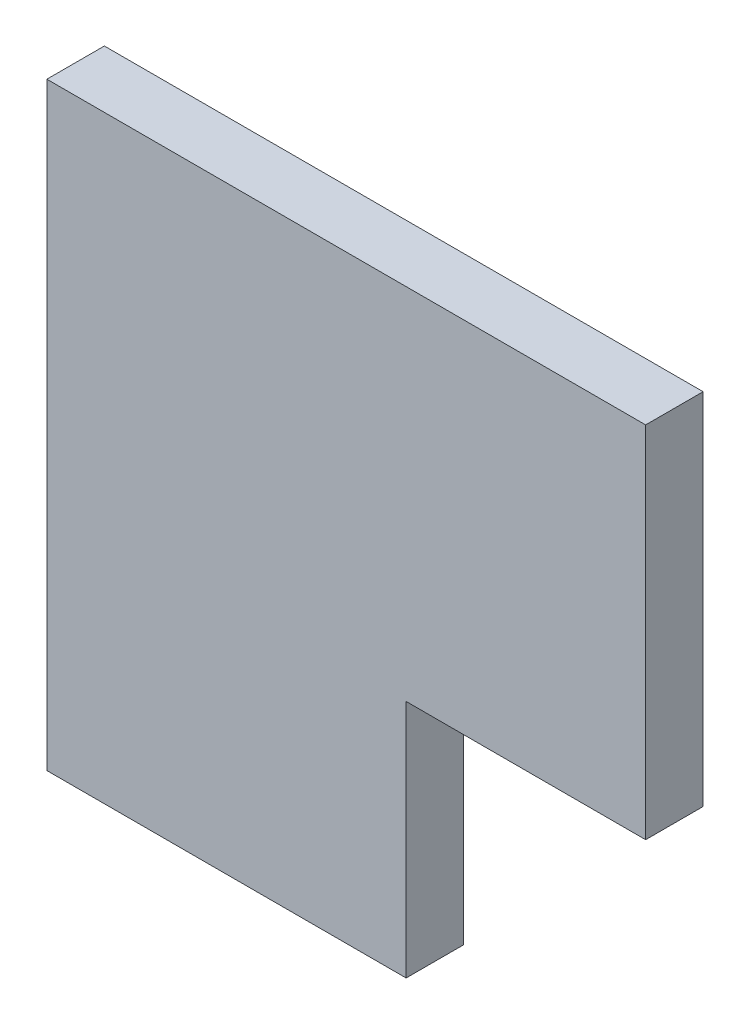
ISO-10303-21;
HEADER;
FILE_DESCRIPTION(('STEP AP214'),'2;1');
FILE_NAME('part.step','',(''),(''),'','','');
FILE_SCHEMA(('AUTOMOTIVE_DESIGN { 1 0 10303 214 1 1 1 1 }'));
ENDSEC;
DATA;
#1=APPLICATION_CONTEXT('core data for automotive mechanical design processes');
#2=APPLICATION_PROTOCOL_DEFINITION('international standard','automotive_design',2000,#1);
#3=PRODUCT_CONTEXT('',#1,'mechanical');
#4=PRODUCT('Part','Part','',(#3));
#5=PRODUCT_RELATED_PRODUCT_CATEGORY('part','',(#4));
#6=PRODUCT_DEFINITION_FORMATION('','',#4);
#7=PRODUCT_DEFINITION_CONTEXT('part definition',#1,'design');
#8=PRODUCT_DEFINITION('design','',#6,#7);
#9=PRODUCT_DEFINITION_SHAPE('','',#8);
#10=(LENGTH_UNIT() NAMED_UNIT(*) SI_UNIT(.MILLI.,.METRE.));
#11=(NAMED_UNIT(*) PLANE_ANGLE_UNIT() SI_UNIT($,.RADIAN.));
#12=(NAMED_UNIT(*) SI_UNIT($,.STERADIAN.) SOLID_ANGLE_UNIT());
#13=UNCERTAINTY_MEASURE_WITH_UNIT(LENGTH_MEASURE(1.E-05),#10,'distance_accuracy_value','');
#14=(GEOMETRIC_REPRESENTATION_CONTEXT(3) GLOBAL_UNCERTAINTY_ASSIGNED_CONTEXT((#13)) GLOBAL_UNIT_ASSIGNED_CONTEXT((#10,
#11,#12)) REPRESENTATION_CONTEXT('',''));
#15=CARTESIAN_POINT('',(0.,0.,0.));
#16=DIRECTION('',(0.,0.,1.));
#17=DIRECTION('',(1.,0.,0.));
#18=AXIS2_PLACEMENT_3D('',#15,#16,#17);
#19=CARTESIAN_POINT('',(-1.,0.,0.12));
#20=DIRECTION('',(0.,1.,0.));
#21=DIRECTION('',(0.,0.,1.));
#22=AXIS2_PLACEMENT_3D('',#19,#20,#21);
#23=PLANE('',#22);
#24=DIRECTION('',(1.,0.,0.));
#25=VECTOR('',#24,1.);
#26=CARTESIAN_POINT('',(-1.,0.,-0.12));
#27=LINE('',#26,#25);
#28=CARTESIAN_POINT('',(-1.,0.,-0.12));
#29=VERTEX_POINT('',#28);
#30=CARTESIAN_POINT('',(0.,0.,-0.12));
#31=VERTEX_POINT('',#30);
#32=EDGE_CURVE('E127',#29,#31,#27,.T.);
#33=ORIENTED_EDGE('',*,*,#32,.T.);
#34=DIRECTION('',(0.,0.,-1.));
#35=VECTOR('',#34,1.);
#36=CARTESIAN_POINT('',(0.,0.,0.12));
#37=LINE('',#36,#35);
#38=CARTESIAN_POINT('',(0.,0.,0.12));
#39=VERTEX_POINT('',#38);
#40=EDGE_CURVE('E11',#39,#31,#37,.T.);
#41=ORIENTED_EDGE('',*,*,#40,.F.);
#42=DIRECTION('',(1.,0.,0.));
#43=VECTOR('',#42,1.);
#44=CARTESIAN_POINT('',(-1.,0.,0.12));
#45=LINE('',#44,#43);
#46=CARTESIAN_POINT('',(-1.,0.,0.12));
#47=VERTEX_POINT('',#46);
#48=EDGE_CURVE('E143',#47,#39,#45,.T.);
#49=ORIENTED_EDGE('',*,*,#48,.F.);
#50=DIRECTION('',(0.,0.,-1.));
#51=VECTOR('',#50,1.);
#52=CARTESIAN_POINT('',(-1.,0.,0.12));
#53=LINE('',#52,#51);
#54=EDGE_CURVE('E123',#47,#29,#53,.T.);
#55=ORIENTED_EDGE('',*,*,#54,.T.);
#56=EDGE_LOOP('',(#33,#41,#49,#55));
#57=FACE_BOUND('',#56,.T.);
#58=ADVANCED_FACE('F38',(#57),#23,.F.);
#59=CARTESIAN_POINT('',(0.,0.,0.12));
#60=DIRECTION('',(-1.,0.,0.));
#61=DIRECTION('',(0.,0.,1.));
#62=AXIS2_PLACEMENT_3D('',#59,#60,#61);
#63=PLANE('',#62);
#64=DIRECTION('',(0.,1.,0.));
#65=VECTOR('',#64,1.);
#66=CARTESIAN_POINT('',(0.,0.,-0.12));
#67=LINE('',#66,#65);
#68=CARTESIAN_POINT('',(0.,1.5,-0.12));
#69=VERTEX_POINT('',#68);
#70=EDGE_CURVE('E131',#31,#69,#67,.T.);
#71=ORIENTED_EDGE('',*,*,#70,.T.);
#72=DIRECTION('',(0.,0.,-1.));
#73=VECTOR('',#72,1.);
#74=CARTESIAN_POINT('',(0.,1.5,0.12));
#75=LINE('',#74,#73);
#76=CARTESIAN_POINT('',(0.,1.5,0.12));
#77=VERTEX_POINT('',#76);
#78=EDGE_CURVE('E47',#77,#69,#75,.T.);
#79=ORIENTED_EDGE('',*,*,#78,.F.);
#80=DIRECTION('',(0.,1.,0.));
#81=VECTOR('',#80,1.);
#82=CARTESIAN_POINT('',(0.,0.,0.12));
#83=LINE('',#82,#81);
#84=EDGE_CURVE('E92',#39,#77,#83,.T.);
#85=ORIENTED_EDGE('',*,*,#84,.F.);
#86=ORIENTED_EDGE('',*,*,#40,.T.);
#87=EDGE_LOOP('',(#71,#79,#85,#86));
#88=FACE_BOUND('',#87,.T.);
#89=ADVANCED_FACE('F171',(#88),#63,.F.);
#90=CARTESIAN_POINT('',(0.,1.5,0.12));
#91=DIRECTION('',(0.,-1.,0.));
#92=DIRECTION('',(1.,0.,0.));
#93=AXIS2_PLACEMENT_3D('',#90,#91,#92);
#94=PLANE('',#93);
#95=DIRECTION('',(-1.,0.,0.));
#96=VECTOR('',#95,1.);
#97=CARTESIAN_POINT('',(0.,1.5,-0.12));
#98=LINE('',#97,#96);
#99=CARTESIAN_POINT('',(-2.5,1.5,-0.12));
#100=VERTEX_POINT('',#99);
#101=EDGE_CURVE('E134',#69,#100,#98,.T.);
#102=ORIENTED_EDGE('',*,*,#101,.T.);
#103=DIRECTION('',(0.,0.,-1.));
#104=VECTOR('',#103,1.);
#105=CARTESIAN_POINT('',(-2.5,1.5,0.12));
#106=LINE('',#105,#104);
#107=CARTESIAN_POINT('',(-2.5,1.5,0.12));
#108=VERTEX_POINT('',#107);
#109=EDGE_CURVE('E116',#108,#100,#106,.T.);
#110=ORIENTED_EDGE('',*,*,#109,.F.);
#111=DIRECTION('',(-1.,0.,0.));
#112=VECTOR('',#111,1.);
#113=CARTESIAN_POINT('',(0.,1.5,0.12));
#114=LINE('',#113,#112);
#115=EDGE_CURVE('E105',#77,#108,#114,.T.);
#116=ORIENTED_EDGE('',*,*,#115,.F.);
#117=ORIENTED_EDGE('',*,*,#78,.T.);
#118=EDGE_LOOP('',(#102,#110,#116,#117));
#119=FACE_BOUND('',#118,.T.);
#120=ADVANCED_FACE('F153',(#119),#94,.F.);
#121=CARTESIAN_POINT('',(-2.5,1.5,0.12));
#122=DIRECTION('',(1.,0.,0.));
#123=DIRECTION('',(0.,0.,-1.));
#124=AXIS2_PLACEMENT_3D('',#121,#122,#123);
#125=PLANE('',#124);
#126=DIRECTION('',(0.,-1.,0.));
#127=VECTOR('',#126,1.);
#128=CARTESIAN_POINT('',(-2.5,1.5,-0.12));
#129=LINE('',#128,#127);
#130=CARTESIAN_POINT('',(-2.5,-1.,-0.12));
#131=VERTEX_POINT('',#130);
#132=EDGE_CURVE('E114',#100,#131,#129,.T.);
#133=ORIENTED_EDGE('',*,*,#132,.T.);
#134=DIRECTION('',(0.,0.,-1.));
#135=VECTOR('',#134,1.);
#136=CARTESIAN_POINT('',(-2.5,-1.,0.12));
#137=LINE('',#136,#135);
#138=CARTESIAN_POINT('',(-2.5,-1.,0.12));
#139=VERTEX_POINT('',#138);
#140=EDGE_CURVE('E111',#139,#131,#137,.T.);
#141=ORIENTED_EDGE('',*,*,#140,.F.);
#142=DIRECTION('',(0.,-1.,0.));
#143=VECTOR('',#142,1.);
#144=CARTESIAN_POINT('',(-2.5,1.5,0.12));
#145=LINE('',#144,#143);
#146=EDGE_CURVE('E99',#108,#139,#145,.T.);
#147=ORIENTED_EDGE('',*,*,#146,.F.);
#148=ORIENTED_EDGE('',*,*,#109,.T.);
#149=EDGE_LOOP('',(#133,#141,#147,#148));
#150=FACE_BOUND('',#149,.T.);
#151=ADVANCED_FACE('F112',(#150),#125,.F.);
#152=CARTESIAN_POINT('',(-2.5,-1.,0.12));
#153=DIRECTION('',(0.,1.,0.));
#154=DIRECTION('',(0.,0.,1.));
#155=AXIS2_PLACEMENT_3D('',#152,#153,#154);
#156=PLANE('',#155);
#157=DIRECTION('',(1.,0.,0.));
#158=VECTOR('',#157,1.);
#159=CARTESIAN_POINT('',(-2.5,-1.,-0.12));
#160=LINE('',#159,#158);
#161=CARTESIAN_POINT('',(-1.,-1.,-0.12));
#162=VERTEX_POINT('',#161);
#163=EDGE_CURVE('E78',#131,#162,#160,.T.);
#164=ORIENTED_EDGE('',*,*,#163,.T.);
#165=DIRECTION('',(0.,0.,-1.));
#166=VECTOR('',#165,1.);
#167=CARTESIAN_POINT('',(-1.,-1.,0.12));
#168=LINE('',#167,#166);
#169=CARTESIAN_POINT('',(-1.,-1.,0.12));
#170=VERTEX_POINT('',#169);
#171=EDGE_CURVE('E117',#170,#162,#168,.T.);
#172=ORIENTED_EDGE('',*,*,#171,.F.);
#173=DIRECTION('',(1.,0.,0.));
#174=VECTOR('',#173,1.);
#175=CARTESIAN_POINT('',(-2.5,-1.,0.12));
#176=LINE('',#175,#174);
#177=EDGE_CURVE('E103',#139,#170,#176,.T.);
#178=ORIENTED_EDGE('',*,*,#177,.F.);
#179=ORIENTED_EDGE('',*,*,#140,.T.);
#180=EDGE_LOOP('',(#164,#172,#178,#179));
#181=FACE_BOUND('',#180,.T.);
#182=ADVANCED_FACE('F119',(#181),#156,.F.);
#183=CARTESIAN_POINT('',(-1.,-1.,0.12));
#184=DIRECTION('',(-1.,0.,0.));
#185=DIRECTION('',(0.,0.,1.));
#186=AXIS2_PLACEMENT_3D('',#183,#184,#185);
#187=PLANE('',#186);
#188=DIRECTION('',(0.,1.,0.));
#189=VECTOR('',#188,1.);
#190=CARTESIAN_POINT('',(-1.,-1.,-0.12));
#191=LINE('',#190,#189);
#192=EDGE_CURVE('E84',#162,#29,#191,.T.);
#193=ORIENTED_EDGE('',*,*,#192,.T.);
#194=ORIENTED_EDGE('',*,*,#54,.F.);
#195=DIRECTION('',(0.,1.,0.));
#196=VECTOR('',#195,1.);
#197=CARTESIAN_POINT('',(-1.,-1.,0.12));
#198=LINE('',#197,#196);
#199=EDGE_CURVE('E55',#170,#47,#198,.T.);
#200=ORIENTED_EDGE('',*,*,#199,.F.);
#201=ORIENTED_EDGE('',*,*,#171,.T.);
#202=EDGE_LOOP('',(#193,#194,#200,#201));
#203=FACE_BOUND('',#202,.T.);
#204=ADVANCED_FACE('F160',(#203),#187,.F.);
#205=CARTESIAN_POINT('',(0.,0.,0.12));
#206=DIRECTION('',(0.,0.,1.));
#207=DIRECTION('',(1.,0.,0.));
#208=AXIS2_PLACEMENT_3D('',#205,#206,#207);
#209=PLANE('',#208);
#210=ORIENTED_EDGE('',*,*,#48,.T.);
#211=ORIENTED_EDGE('',*,*,#84,.T.);
#212=ORIENTED_EDGE('',*,*,#115,.T.);
#213=ORIENTED_EDGE('',*,*,#146,.T.);
#214=ORIENTED_EDGE('',*,*,#177,.T.);
#215=ORIENTED_EDGE('',*,*,#199,.T.);
#216=EDGE_LOOP('',(#210,#211,#212,#213,#214,#215));
#217=FACE_BOUND('',#216,.T.);
#218=ADVANCED_FACE('F101',(#217),#209,.T.);
#219=CARTESIAN_POINT('',(0.,0.,-0.12));
#220=DIRECTION('',(0.,0.,1.));
#221=DIRECTION('',(1.,0.,0.));
#222=AXIS2_PLACEMENT_3D('',#219,#220,#221);
#223=PLANE('',#222);
#224=ORIENTED_EDGE('',*,*,#32,.F.);
#225=ORIENTED_EDGE('',*,*,#192,.F.);
#226=ORIENTED_EDGE('',*,*,#163,.F.);
#227=ORIENTED_EDGE('',*,*,#132,.F.);
#228=ORIENTED_EDGE('',*,*,#101,.F.);
#229=ORIENTED_EDGE('',*,*,#70,.F.);
#230=EDGE_LOOP('',(#224,#225,#226,#227,#228,#229));
#231=FACE_BOUND('',#230,.T.);
#232=ADVANCED_FACE('F156',(#231),#223,.F.);
#233=CLOSED_SHELL('',(#58,#89,#120,#151,#182,#204,#218,#232));
#234=MANIFOLD_SOLID_BREP('B2',#233);
#235=ADVANCED_BREP_SHAPE_REPRESENTATION('',(#18,#234),#14);
#236=SHAPE_DEFINITION_REPRESENTATION(#9,#235);
ENDSEC;
END-ISO-10303-21;
